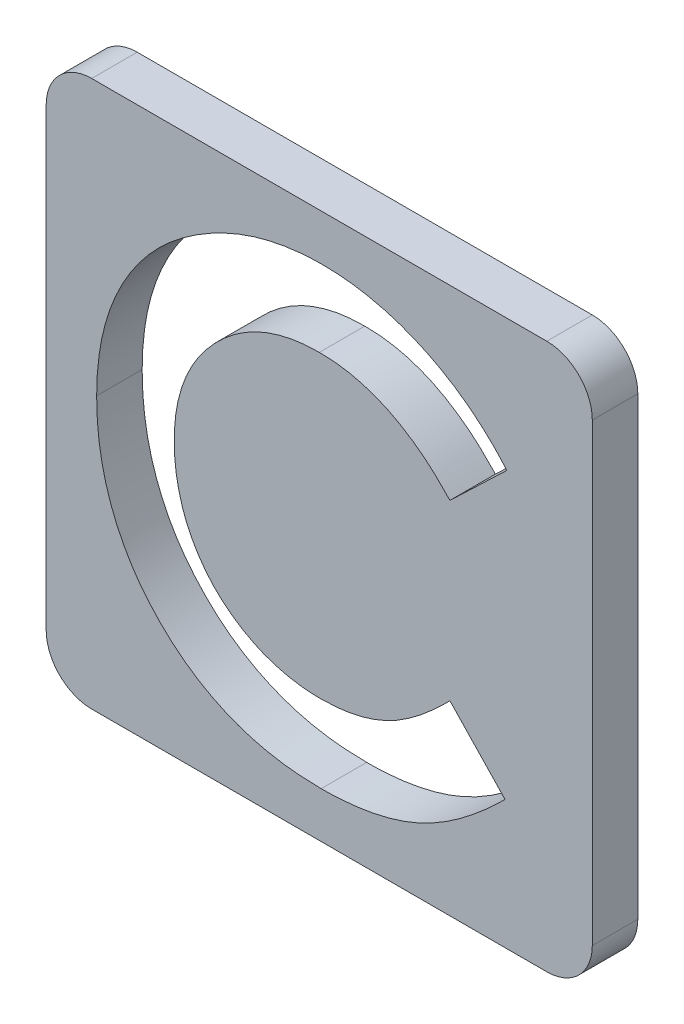
ISO-10303-21;
HEADER;
FILE_DESCRIPTION(('STEP AP214'),'2;1');
FILE_NAME('part.step','',(''),(''),'','','');
FILE_SCHEMA(('AUTOMOTIVE_DESIGN { 1 0 10303 214 1 1 1 1 }'));
ENDSEC;
DATA;
#1=APPLICATION_CONTEXT('core data for automotive mechanical design processes');
#2=APPLICATION_PROTOCOL_DEFINITION('international standard','automotive_design',2000,#1);
#3=PRODUCT_CONTEXT('',#1,'mechanical');
#4=PRODUCT('Part','Part','',(#3));
#5=PRODUCT_RELATED_PRODUCT_CATEGORY('part','',(#4));
#6=PRODUCT_DEFINITION_FORMATION('','',#4);
#7=PRODUCT_DEFINITION_CONTEXT('part definition',#1,'design');
#8=PRODUCT_DEFINITION('design','',#6,#7);
#9=PRODUCT_DEFINITION_SHAPE('','',#8);
#10=(LENGTH_UNIT() NAMED_UNIT(*) SI_UNIT(.MILLI.,.METRE.));
#11=(NAMED_UNIT(*) PLANE_ANGLE_UNIT() SI_UNIT($,.RADIAN.));
#12=(NAMED_UNIT(*) SI_UNIT($,.STERADIAN.) SOLID_ANGLE_UNIT());
#13=UNCERTAINTY_MEASURE_WITH_UNIT(LENGTH_MEASURE(1.E-05),#10,'distance_accuracy_value','');
#14=(GEOMETRIC_REPRESENTATION_CONTEXT(3) GLOBAL_UNCERTAINTY_ASSIGNED_CONTEXT((#13)) GLOBAL_UNIT_ASSIGNED_CONTEXT((#10,
#11,#12)) REPRESENTATION_CONTEXT('',''));
#15=CARTESIAN_POINT('',(0.,0.,0.));
#16=DIRECTION('',(0.,0.,1.));
#17=DIRECTION('',(1.,0.,0.));
#18=AXIS2_PLACEMENT_3D('',#15,#16,#17);
#19=CARTESIAN_POINT('',(50.,50.,10.));
#20=DIRECTION('',(0.,0.,-1.));
#21=DIRECTION('',(-1.,0.,0.));
#22=AXIS2_PLACEMENT_3D('',#19,#20,#21);
#23=PLANE('',#22);
#24=DIRECTION('',(1.,0.,0.));
#25=VECTOR('',#24,1.);
#26=CARTESIAN_POINT('',(-49.9999999999999,60.,10.));
#27=LINE('',#26,#25);
#28=CARTESIAN_POINT('',(-49.9999999999999,60.,10.));
#29=VERTEX_POINT('',#28);
#30=CARTESIAN_POINT('',(49.9999999999999,60.,10.));
#31=VERTEX_POINT('',#30);
#32=EDGE_CURVE('E276',#29,#31,#27,.T.);
#33=ORIENTED_EDGE('',*,*,#32,.F.);
#34=CARTESIAN_POINT('',(-50.,50.,10.));
#35=DIRECTION('',(0.,0.,1.));
#36=DIRECTION('',(1.,0.,0.));
#37=AXIS2_PLACEMENT_3D('',#34,#35,#36);
#38=CIRCLE('',#37,10.);
#39=CARTESIAN_POINT('',(-60.,49.9999999999999,10.));
#40=VERTEX_POINT('',#39);
#41=EDGE_CURVE('E263',#29,#40,#38,.T.);
#42=ORIENTED_EDGE('',*,*,#41,.T.);
#43=DIRECTION('',(0.,-1.,0.));
#44=VECTOR('',#43,1.);
#45=CARTESIAN_POINT('',(-60.,49.9999999999999,10.));
#46=LINE('',#45,#44);
#47=CARTESIAN_POINT('',(-60.,-49.9999999999999,10.));
#48=VERTEX_POINT('',#47);
#49=EDGE_CURVE('E291',#40,#48,#46,.T.);
#50=ORIENTED_EDGE('',*,*,#49,.T.);
#51=CARTESIAN_POINT('',(-50.,-50.,10.));
#52=DIRECTION('',(0.,0.,1.));
#53=DIRECTION('',(1.,0.,0.));
#54=AXIS2_PLACEMENT_3D('',#51,#52,#53);
#55=CIRCLE('',#54,10.);
#56=CARTESIAN_POINT('',(-49.9999999999999,-60.,10.));
#57=VERTEX_POINT('',#56);
#58=EDGE_CURVE('E295',#48,#57,#55,.T.);
#59=ORIENTED_EDGE('',*,*,#58,.T.);
#60=DIRECTION('',(1.,0.,0.));
#61=VECTOR('',#60,1.);
#62=CARTESIAN_POINT('',(-49.9999999999999,-60.,10.));
#63=LINE('',#62,#61);
#64=CARTESIAN_POINT('',(49.9999999999999,-60.,10.));
#65=VERTEX_POINT('',#64);
#66=EDGE_CURVE('E298',#57,#65,#63,.T.);
#67=ORIENTED_EDGE('',*,*,#66,.T.);
#68=CARTESIAN_POINT('',(50.,-50.,10.));
#69=DIRECTION('',(0.,0.,1.));
#70=DIRECTION('',(1.,0.,0.));
#71=AXIS2_PLACEMENT_3D('',#68,#69,#70);
#72=CIRCLE('',#71,10.);
#73=CARTESIAN_POINT('',(60.,-50.,10.));
#74=VERTEX_POINT('',#73);
#75=EDGE_CURVE('E302',#65,#74,#72,.T.);
#76=ORIENTED_EDGE('',*,*,#75,.T.);
#77=DIRECTION('',(0.,-1.,0.));
#78=VECTOR('',#77,1.);
#79=CARTESIAN_POINT('',(60.,49.9999999999999,10.));
#80=LINE('',#79,#78);
#81=CARTESIAN_POINT('',(60.,49.9999999999999,10.));
#82=VERTEX_POINT('',#81);
#83=EDGE_CURVE('E304',#82,#74,#80,.T.);
#84=ORIENTED_EDGE('',*,*,#83,.F.);
#85=CARTESIAN_POINT('',(50.,50.,10.));
#86=DIRECTION('',(0.,0.,-1.));
#87=DIRECTION('',(-1.,0.,0.));
#88=AXIS2_PLACEMENT_3D('',#85,#86,#87);
#89=CIRCLE('',#88,10.);
#90=EDGE_CURVE('E307',#31,#82,#89,.T.);
#91=ORIENTED_EDGE('',*,*,#90,.F.);
#92=EDGE_LOOP('',(#33,#42,#50,#59,#67,#76,#84,#91));
#93=FACE_BOUND('',#92,.T.);
#94=CARTESIAN_POINT('',(0.683092948717948,49.9358974358974,10.));
#95=CARTESIAN_POINT('',(1.6414388950842,49.9215416320597,10.));
#96=CARTESIAN_POINT('',(3.54816665778287,49.892979284781,10.));
#97=CARTESIAN_POINT('',(6.3876042585156,49.6548810430474,10.));
#98=CARTESIAN_POINT('',(9.20433336669228,49.2809501628442,10.));
#99=CARTESIAN_POINT('',(11.9882692277431,48.7167680966395,10.));
#100=CARTESIAN_POINT('',(14.7593253968799,48.0470126886051,10.));
#101=CARTESIAN_POINT('',(17.481087090889,47.1700603663098,10.));
#102=CARTESIAN_POINT('',(20.1964915722609,46.1925317405233,10.));
#103=CARTESIAN_POINT('',(22.8629517543219,45.0240958678139,10.));
#104=CARTESIAN_POINT('',(25.4841896245245,43.7486425696483,10.));
#105=CARTESIAN_POINT('',(27.998798557253,42.3015944837229,10.));
#106=CARTESIAN_POINT('',(30.4489986039729,40.7720013332597,10.));
#107=CARTESIAN_POINT('',(32.7804948027195,39.0693350937347,10.));
#108=CARTESIAN_POINT('',(35.036961097733,37.2553546354965,10.));
#109=CARTESIAN_POINT('',(37.2065982294083,35.3215967212293,10.));
#110=CARTESIAN_POINT('',(39.2703663632576,33.2358199292499,10.));
#111=CARTESIAN_POINT('',(40.5654726543483,31.7620955004585,10.));
#112=CARTESIAN_POINT('',(41.2179487179487,31.0196314102564,10.));
#113=B_SPLINE_CURVE_WITH_KNOTS('',3,(#94,#95,#96,#97,#98,#99,#100,#101,#102,#103,#104,#105,#106,
#107,#108,#109,#110,#111,#112),.UNSPECIFIED.,.F.,.F.,(4,1,1,1,1,1,1,1,1,1,1,1,1,1,1,1,4),(0.,
0.0622757783707705,0.123904062007518,0.185067240768729,0.246840151520206,0.308435329849778,
0.370241250709108,0.432586588879854,0.495924581661242,0.559351070950926,0.62194265420109,
0.684392867235184,0.746985808264523,0.809441464531699,0.872507832713939,0.935769297066228,1.),.UNSPECIFIED.);
#114=CARTESIAN_POINT('',(0.683092948717948,49.9358974358974,10.));
#115=VERTEX_POINT('',#114);
#116=CARTESIAN_POINT('',(41.2179487179487,31.0196314102564,10.));
#117=VERTEX_POINT('',#116);
#118=EDGE_CURVE('E50',#115,#117,#113,.T.);
#119=ORIENTED_EDGE('',*,*,#118,.T.);
#120=DIRECTION('',(-0.722880768094852,-0.690972788985642,0.));
#121=VECTOR('',#120,1.);
#122=CARTESIAN_POINT('',(41.2179487179487,31.0196314102564,10.));
#123=LINE('',#122,#121);
#124=CARTESIAN_POINT('',(28.7149439102564,19.0685096153846,10.));
#125=VERTEX_POINT('',#124);
#126=EDGE_CURVE('E174',#117,#125,#123,.T.);
#127=ORIENTED_EDGE('',*,*,#126,.T.);
#128=CARTESIAN_POINT('',(28.7149439102564,19.0685096153846,10.));
#129=CARTESIAN_POINT('',(27.6543371828896,20.1651787490928,10.));
#130=CARTESIAN_POINT('',(25.5826399671481,22.3073171424003,10.));
#131=CARTESIAN_POINT('',(22.2443561180767,25.1433195950283,10.));
#132=CARTESIAN_POINT('',(18.7726624634221,27.5067439140349,10.));
#133=CARTESIAN_POINT('',(15.2350938734894,29.49720482819,10.));
#134=CARTESIAN_POINT('',(11.5680197443271,31.0031303696967,10.));
#135=CARTESIAN_POINT('',(7.8138414387126,32.1005236779949,10.));
#136=CARTESIAN_POINT('',(3.94858742390227,32.7695628997128,10.));
#137=CARTESIAN_POINT('',(1.33273217597597,32.8461128271249,10.));
#138=CARTESIAN_POINT('',(0.0170272435897484,32.8846153846154,10.));
#139=B_SPLINE_CURVE_WITH_KNOTS('',3,(#128,#129,#130,#131,#132,#133,#134,#135,#136,#137,#138),
.UNSPECIFIED.,.F.,.F.,(4,1,1,1,1,1,1,1,4),(0.,0.139406438181739,0.272304448374159,
0.399525336271758,0.522810878257822,0.642662716591868,0.761022620809522,0.879800796783804,1.),.UNSPECIFIED.);
#140=CARTESIAN_POINT('',(0.0170272435897484,32.8846153846154,10.));
#141=VERTEX_POINT('',#140);
#142=EDGE_CURVE('E373',#125,#141,#139,.T.);
#143=ORIENTED_EDGE('',*,*,#142,.T.);
#144=CARTESIAN_POINT('',(0.0170272435897484,32.8846153846154,10.));
#145=CARTESIAN_POINT('',(-1.08174626385413,32.8541970182765,10.));
#146=CARTESIAN_POINT('',(-3.250054721012,32.7941697237171,10.));
#147=CARTESIAN_POINT('',(-6.43369974125528,32.3541104478809,10.));
#148=CARTESIAN_POINT('',(-9.47902073717016,31.6057704982814,10.));
#149=CARTESIAN_POINT('',(-12.3964423251222,30.574419426697,10.));
#150=CARTESIAN_POINT('',(-15.1773798667987,29.2399058794271,10.));
#151=CARTESIAN_POINT('',(-17.8276639433846,27.6032627352334,10.));
#152=CARTESIAN_POINT('',(-20.340760389412,25.6792712093866,10.));
#153=CARTESIAN_POINT('',(-22.683472656629,23.4778861225414,10.));
#154=CARTESIAN_POINT('',(-24.8265035071409,21.0727074879972,10.));
#155=CARTESIAN_POINT('',(-26.7200077180269,18.5063876225818,10.));
#156=CARTESIAN_POINT('',(-28.3061212304693,15.7848058216517,10.));
#157=CARTESIAN_POINT('',(-29.607818790349,12.9355242651222,10.));
#158=CARTESIAN_POINT('',(-30.6217908706497,9.94535506762493,9.99999999999999));
#159=CARTESIAN_POINT('',(-31.3458943293177,6.81631132949547,10.));
#160=CARTESIAN_POINT('',(-31.7646964183768,3.54466660145284,10.));
#161=CARTESIAN_POINT('',(-31.8272054368862,1.32062689333813,10.));
#162=CARTESIAN_POINT('',(-31.8589743589744,0.190304487179487,10.));
#163=B_SPLINE_CURVE_WITH_KNOTS('',3,(#144,#145,#146,#147,#148,#149,#150,#151,#152,#153,#154,
#155,#156,#157,#158,#159,#160,#161,#162),.UNSPECIFIED.,.F.,.F.,(4,1,1,1,1,1,1,1,1,1,1,1,1,1,1,1,
4),(0.,0.0647145165408359,0.127706968329453,0.188882162817117,0.249158298722329,
0.309661028748886,0.370224886057185,0.432332221972585,0.495781858993871,0.559304076520427,
0.621860558361525,0.683321537332506,0.744522974782334,0.806088371210511,0.868994314670206,
0.933419056808136,1.),.UNSPECIFIED.);
#164=CARTESIAN_POINT('',(-31.8589743589744,0.190304487179487,10.));
#165=VERTEX_POINT('',#164);
#166=EDGE_CURVE('E365',#141,#165,#163,.T.);
#167=ORIENTED_EDGE('',*,*,#166,.T.);
#168=CARTESIAN_POINT('',(-31.8589743589744,0.190304487179487,10.));
#169=CARTESIAN_POINT('',(-31.8498189179352,-0.603034863446468,10.));
#170=CARTESIAN_POINT('',(-31.83177335554,-2.16672302341807,10.));
#171=CARTESIAN_POINT('',(-31.634232762686,-4.4798517984017,10.));
#172=CARTESIAN_POINT('',(-31.3161458279577,-6.72413355956989,10.));
#173=CARTESIAN_POINT('',(-30.8557952256811,-8.89616881815302,10.));
#174=CARTESIAN_POINT('',(-30.2801222721053,-10.9978398793892,10.));
#175=CARTESIAN_POINT('',(-29.6047268175794,-13.0472777525623,10.));
#176=CARTESIAN_POINT('',(-28.7574531550083,-15.0161638208577,9.99999999999999));
#177=CARTESIAN_POINT('',(-27.8169666056716,-16.9273654178592,10.));
#178=CARTESIAN_POINT('',(-26.7231915867733,-18.7287330156188,10.));
#179=CARTESIAN_POINT('',(-25.5439003417232,-20.4464865204338,10.));
#180=CARTESIAN_POINT('',(-24.2651515256686,-22.0722056756717,10.));
#181=CARTESIAN_POINT('',(-22.8786626067783,-23.5992444917704,10.));
#182=CARTESIAN_POINT('',(-21.3649204790668,-25.0037387719513,10.));
#183=CARTESIAN_POINT('',(-19.7630497756387,-26.3279233303735,10.));
#184=CARTESIAN_POINT('',(-18.0460291543225,-27.5386493422964,10.));
#185=CARTESIAN_POINT('',(-16.2495254847516,-28.6663013101654,10.));
#186=CARTESIAN_POINT('',(-14.3580192454623,-29.6459021684358,10.));
#187=CARTESIAN_POINT('',(-12.4228313862602,-30.5332312938448,10.));
#188=CARTESIAN_POINT('',(-10.4146205588612,-31.2538744704302,10.));
#189=CARTESIAN_POINT('',(-8.35783793626946,-31.8347786138921,10.));
#190=CARTESIAN_POINT('',(-6.25983373465492,-32.3287508307435,10.));
#191=CARTESIAN_POINT('',(-4.10008752441208,-32.6329047056877,9.99999999999999));
#192=CARTESIAN_POINT('',(-1.89732160047327,-32.8632368752366,10.));
#193=CARTESIAN_POINT('',(-0.408621568924704,-32.8774585403721,10.));
#194=CARTESIAN_POINT('',(0.340544871794871,-32.8846153846154,10.));
#195=B_SPLINE_CURVE_WITH_KNOTS('',3,(#168,#169,#170,#171,#172,#173,#174,#175,#176,#177,#178,
#179,#180,#181,#182,#183,#184,#185,#186,#187,#188,#189,#190,#191,#192,#193,#194),.UNSPECIFIED.,
.F.,.F.,(4,1,1,1,1,1,1,1,1,1,1,1,1,1,1,1,1,1,1,1,1,1,1,1,4),(0.,0.0459858533955716,
0.0906390618643955,0.134485273386869,0.177331356125942,0.219264832978247,0.260785002358145,
0.302316572337849,0.343435729403752,0.384181473765631,0.424375738997743,0.464181121951782,
0.50401198252761,0.543822462310405,0.583802464576023,0.624418535098884,0.665547559578536,
0.706674939653633,0.747826978897574,0.788895116557047,0.830219357972813,0.871706936947863,
0.913733853604737,0.956587827984187,1.),.UNSPECIFIED.);
#196=CARTESIAN_POINT('',(0.340544871794871,-32.8846153846154,10.));
#197=VERTEX_POINT('',#196);
#198=EDGE_CURVE('E357',#165,#197,#195,.T.);
#199=ORIENTED_EDGE('',*,*,#198,.T.);
#200=CARTESIAN_POINT('',(0.340544871794871,-32.8846153846154,10.));
#201=CARTESIAN_POINT('',(1.61125990285429,-32.8478595625839,10.));
#202=CARTESIAN_POINT('',(4.10788450320254,-32.7756439302455,10.));
#203=CARTESIAN_POINT('',(7.77204008696177,-32.2109279112574,10.));
#204=CARTESIAN_POINT('',(11.2636153187849,-31.2820020170017,10.));
#205=CARTESIAN_POINT('',(14.0533672208292,-30.1849945120394,10.));
#206=CARTESIAN_POINT('',(16.2390641482272,-29.1016853592582,10.));
#207=CARTESIAN_POINT('',(17.903002907688,-28.0996777401587,10.));
#208=CARTESIAN_POINT('',(19.6236452718875,-26.9788222038627,10.));
#209=CARTESIAN_POINT('',(21.3724128426247,-25.69681644862,10.));
#210=CARTESIAN_POINT('',(23.1689757860175,-24.269045057575,10.));
#211=CARTESIAN_POINT('',(24.9816206235545,-22.6642371732615,10.));
#212=CARTESIAN_POINT('',(26.8567513849792,-20.9352368171773,10.));
#213=CARTESIAN_POINT('',(28.0851309596324,-19.7012152962966,10.));
#214=CARTESIAN_POINT('',(28.7149439102564,-19.0685096153846,10.));
#215=B_SPLINE_CURVE_WITH_KNOTS('',3,(#200,#201,#202,#203,#204,#205,#206,#207,#208,#209,#210,
#211,#212,#213,#214),.UNSPECIFIED.,.F.,.F.,(4,1,1,1,1,1,1,1,1,1,1,1,4),(0.,0.117048429048343,
0.229969725903514,0.340703507658765,0.449355146911558,0.50555651152082,0.565302669775755,
0.628204956476601,0.694728991831128,0.765018833651914,0.839580202195728,0.917749799590948,1.),.UNSPECIFIED.);
#216=CARTESIAN_POINT('',(28.7149439102564,-19.0685096153846,10.));
#217=VERTEX_POINT('',#216);
#218=EDGE_CURVE('E352',#197,#217,#215,.T.);
#219=ORIENTED_EDGE('',*,*,#218,.T.);
#220=DIRECTION('',(0.689574074589039,-0.724215158398849,0.));
#221=VECTOR('',#220,1.);
#222=CARTESIAN_POINT('',(28.7149439102564,-19.0685096153846,10.));
#223=LINE('',#222,#221);
#224=CARTESIAN_POINT('',(40.8373397435898,-31.7998798076923,10.));
#225=VERTEX_POINT('',#224);
#226=EDGE_CURVE('E346',#217,#225,#223,.T.);
#227=ORIENTED_EDGE('',*,*,#226,.T.);
#228=CARTESIAN_POINT('',(40.8373397435898,-31.7998798076923,10.));
#229=CARTESIAN_POINT('',(39.9852005661752,-32.6225934310408,10.));
#230=CARTESIAN_POINT('',(38.322007127671,-34.2283544808645,10.));
#231=CARTESIAN_POINT('',(35.8131259977684,-36.5083853312382,10.));
#232=CARTESIAN_POINT('',(33.3074023940033,-38.5572465113824,10.));
#233=CARTESIAN_POINT('',(30.8653693786104,-40.4493027025307,10.));
#234=CARTESIAN_POINT('',(28.4470239038456,-42.1294337124443,10.));
#235=CARTESIAN_POINT('',(26.052622431243,-43.5993175079247,10.));
#236=CARTESIAN_POINT('',(23.7092706321045,-44.8961295763549,10.));
#237=CARTESIAN_POINT('',(21.3683080555382,-45.9979998183041,10.));
#238=CARTESIAN_POINT('',(19.0151680241677,-46.9336020935463,10.));
#239=CARTESIAN_POINT('',(16.5940634634566,-47.7390942430533,10.));
#240=CARTESIAN_POINT('',(14.0975928289585,-48.4205116240085,10.));
#241=CARTESIAN_POINT('',(11.5105088172133,-48.9703259582788,10.));
#242=CARTESIAN_POINT('',(8.85694217143702,-49.4112028294906,10.));
#243=CARTESIAN_POINT('',(6.11205903351559,-49.7087921675179,10.));
#244=CARTESIAN_POINT('',(3.29326331804326,-49.9088515785832,10.));
#245=CARTESIAN_POINT('',(1.38123051406405,-49.9268285745489,10.));
#246=CARTESIAN_POINT('',(0.416666666666669,-49.9358974358974,10.));
#247=B_SPLINE_CURVE_WITH_KNOTS('',3,(#228,#229,#230,#231,#232,#233,#234,#235,#236,#237,#238,
#239,#240,#241,#242,#243,#244,#245,#246),.UNSPECIFIED.,.F.,.F.,(4,1,1,1,1,1,1,1,1,1,1,1,1,1,1,1,
4),(0.,0.0777829363133484,0.15181565726911,0.222539838580063,0.290277534682293,0.35464060748638,
0.415797753485032,0.474709007669867,0.530426099620042,0.585579745825265,0.640906164804031,
0.697901090665671,0.755420320880605,0.814521258487291,0.874461831215908,0.936669716740424,1.),.UNSPECIFIED.);
#248=CARTESIAN_POINT('',(0.416666666666669,-49.9358974358974,10.));
#249=VERTEX_POINT('',#248);
#250=EDGE_CURVE('E338',#225,#249,#247,.T.);
#251=ORIENTED_EDGE('',*,*,#250,.T.);
#252=CARTESIAN_POINT('',(0.416666666666669,-49.9358974358974,10.));
#253=CARTESIAN_POINT('',(-1.35511764048741,-49.8907311204767,10.));
#254=CARTESIAN_POINT('',(-4.8220070317626,-49.8023531959502,10.));
#255=CARTESIAN_POINT('',(-9.9026430411407,-49.1475326122616,10.));
#256=CARTESIAN_POINT('',(-14.7291108685673,-48.0497374394682,10.));
#257=CARTESIAN_POINT('',(-19.3131524067437,-46.4971522687101,10.));
#258=CARTESIAN_POINT('',(-23.65331003716,-44.5137974765133,10.));
#259=CARTESIAN_POINT('',(-27.748473415126,-42.0822976319479,10.));
#260=CARTESIAN_POINT('',(-31.5920420476894,-39.2091128467249,10.));
#261=CARTESIAN_POINT('',(-35.1529674656885,-35.9279196360063,10.));
#262=CARTESIAN_POINT('',(-38.3739939777715,-32.3041171888927,10.));
#263=CARTESIAN_POINT('',(-41.2210084009614,-28.4131475158562,10.));
#264=CARTESIAN_POINT('',(-43.576058839203,-24.2358879265889,10.));
#265=CARTESIAN_POINT('',(-45.5315079636882,-19.834049889149,10.));
#266=CARTESIAN_POINT('',(-47.0606434613855,-15.1875461067638,10.));
#267=CARTESIAN_POINT('',(-48.1368956209843,-10.2913504774402,10.));
#268=CARTESIAN_POINT('',(-48.8006124732255,-5.15019058080106,10.));
#269=CARTESIAN_POINT('',(-48.8732240401022,-1.63865985863004,10.));
#270=CARTESIAN_POINT('',(-48.9102564102564,0.152243589743591,10.));
#271=B_SPLINE_CURVE_WITH_KNOTS('',3,(#252,#253,#254,#255,#256,#257,#258,#259,#260,#261,#262,
#263,#264,#265,#266,#267,#268,#269,#270),.UNSPECIFIED.,.F.,.F.,(4,1,1,1,1,1,1,1,1,1,1,1,1,1,1,1,
4),(0.,0.0673762427992636,0.13183657877631,0.194461067601586,0.255345967743414,
0.315588340013611,0.375627451772199,0.436137852052541,0.497778619574713,0.559470361094052,
0.620277769679113,0.680787688960419,0.741491621591654,0.803215436253189,0.866492762748931,
0.93191044291136,1.),.UNSPECIFIED.);
#272=CARTESIAN_POINT('',(-48.9102564102564,0.152243589743591,10.));
#273=VERTEX_POINT('',#272);
#274=EDGE_CURVE('E330',#249,#273,#271,.T.);
#275=ORIENTED_EDGE('',*,*,#274,.T.);
#276=CARTESIAN_POINT('',(-48.9102564102564,0.152243589743591,10.));
#277=CARTESIAN_POINT('',(-48.8946083254413,1.32025553906331,10.));
#278=CARTESIAN_POINT('',(-48.8635976458552,3.63496975112692,10.));
#279=CARTESIAN_POINT('',(-48.5376725314663,7.04473131735693,10.));
#280=CARTESIAN_POINT('',(-48.0833139704202,10.3686389312451,10.));
#281=CARTESIAN_POINT('',(-47.3625154285296,13.5721794174049,10.));
#282=CARTESIAN_POINT('',(-46.4936638775408,16.6985103745436,10.));
#283=CARTESIAN_POINT('',(-45.4131328198244,19.7136522362996,10.));
#284=CARTESIAN_POINT('',(-44.1226480127642,22.6262708239943,10.));
#285=CARTESIAN_POINT('',(-42.6638048206116,25.4412420361837,10.));
#286=CARTESIAN_POINT('',(-41.0134301128869,28.1401247952757,10.));
#287=CARTESIAN_POINT('',(-39.1697803870455,30.6997314449122,10.));
#288=CARTESIAN_POINT('',(-37.1803183762632,33.1398216771891,10.));
#289=CARTESIAN_POINT('',(-34.9972405495233,35.4280231654656,10.));
#290=CARTESIAN_POINT('',(-32.6522698879186,37.5844267636515,10.));
#291=CARTESIAN_POINT('',(-30.1348191176785,39.5973465075458,10.));
#292=CARTESIAN_POINT('',(-27.4600294476838,41.4956499372077,10.));
#293=CARTESIAN_POINT('',(-24.6206612168742,43.2303844145202,10.));
#294=CARTESIAN_POINT('',(-21.6718757842472,44.799543953991,10.));
#295=CARTESIAN_POINT('',(-18.6508650941563,46.1836096851907,10.));
#296=CARTESIAN_POINT('',(-15.565051419364,47.3403699093811,10.));
#297=CARTESIAN_POINT('',(-12.4274818596488,48.2998598447642,10.));
#298=CARTESIAN_POINT('',(-9.2249002238419,49.0160512377176,10.));
#299=CARTESIAN_POINT('',(-5.98016572462047,49.558185017584,10.));
#300=CARTESIAN_POINT('',(-2.66566956771341,49.8612412667287,10.));
#301=CARTESIAN_POINT('',(-0.440272541660435,49.9108535088717,10.));
#302=CARTESIAN_POINT('',(0.683092948717948,49.9358974358974,10.));
#303=B_SPLINE_CURVE_WITH_KNOTS('',3,(#276,#277,#278,#279,#280,#281,#282,#283,#284,#285,#286,
#287,#288,#289,#290,#291,#292,#293,#294,#295,#296,#297,#298,#299,#300,#301,#302),.UNSPECIFIED.,
.F.,.F.,(4,1,1,1,1,1,1,1,1,1,1,1,1,1,1,1,1,1,1,1,1,1,1,1,4),(0.,0.0446633309063708,
0.0885118057801454,0.130925591301777,0.172904037280887,0.214000119904966,0.254985020358983,
0.295291276387059,0.335772441952788,0.37618082055377,0.416178408474521,0.456350051444474,
0.496512166644416,0.53704057363778,0.578118744007762,0.619724560554812,0.662421970198883,
0.705298953520903,0.747430000533911,0.789432984039383,0.831267421203061,0.872825095964229,
0.914870110484392,0.9570270028395,1.),.UNSPECIFIED.);
#304=EDGE_CURVE('E168',#273,#115,#303,.T.);
#305=ORIENTED_EDGE('',*,*,#304,.T.);
#306=EDGE_LOOP('',(#119,#127,#143,#167,#199,#219,#227,#251,#275,#305));
#307=FACE_BOUND('',#306,.T.);
#308=ADVANCED_FACE('F33',(#93,#307),#23,.F.);
#309=CARTESIAN_POINT('',(50.,50.,0.));
#310=DIRECTION('',(0.,0.,-1.));
#311=DIRECTION('',(-1.,0.,0.));
#312=AXIS2_PLACEMENT_3D('',#309,#310,#311);
#313=PLANE('',#312);
#314=DIRECTION('',(1.,0.,0.));
#315=VECTOR('',#314,1.);
#316=CARTESIAN_POINT('',(-49.9999999999999,60.,0.));
#317=LINE('',#316,#315);
#318=CARTESIAN_POINT('',(-49.9999999999999,60.,0.));
#319=VERTEX_POINT('',#318);
#320=CARTESIAN_POINT('',(49.9999999999999,60.,0.));
#321=VERTEX_POINT('',#320);
#322=EDGE_CURVE('E175',#319,#321,#317,.T.);
#323=ORIENTED_EDGE('',*,*,#322,.T.);
#324=CARTESIAN_POINT('',(50.,50.,0.));
#325=DIRECTION('',(0.,0.,-1.));
#326=DIRECTION('',(-1.,0.,0.));
#327=AXIS2_PLACEMENT_3D('',#324,#325,#326);
#328=CIRCLE('',#327,10.);
#329=CARTESIAN_POINT('',(60.,49.9999999999999,0.));
#330=VERTEX_POINT('',#329);
#331=EDGE_CURVE('E247',#321,#330,#328,.T.);
#332=ORIENTED_EDGE('',*,*,#331,.T.);
#333=DIRECTION('',(0.,-1.,0.));
#334=VECTOR('',#333,1.);
#335=CARTESIAN_POINT('',(60.,49.9999999999999,0.));
#336=LINE('',#335,#334);
#337=CARTESIAN_POINT('',(60.,-50.,0.));
#338=VERTEX_POINT('',#337);
#339=EDGE_CURVE('E254',#330,#338,#336,.T.);
#340=ORIENTED_EDGE('',*,*,#339,.T.);
#341=CARTESIAN_POINT('',(50.,-50.,0.));
#342=DIRECTION('',(0.,0.,1.));
#343=DIRECTION('',(1.,0.,0.));
#344=AXIS2_PLACEMENT_3D('',#341,#342,#343);
#345=CIRCLE('',#344,10.);
#346=CARTESIAN_POINT('',(49.9999999999999,-60.,0.));
#347=VERTEX_POINT('',#346);
#348=EDGE_CURVE('E267',#347,#338,#345,.T.);
#349=ORIENTED_EDGE('',*,*,#348,.F.);
#350=DIRECTION('',(1.,0.,0.));
#351=VECTOR('',#350,1.);
#352=CARTESIAN_POINT('',(-49.9999999999999,-60.,0.));
#353=LINE('',#352,#351);
#354=CARTESIAN_POINT('',(-49.9999999999999,-60.,0.));
#355=VERTEX_POINT('',#354);
#356=EDGE_CURVE('E270',#355,#347,#353,.T.);
#357=ORIENTED_EDGE('',*,*,#356,.F.);
#358=CARTESIAN_POINT('',(-50.,-50.,0.));
#359=DIRECTION('',(0.,0.,1.));
#360=DIRECTION('',(1.,0.,0.));
#361=AXIS2_PLACEMENT_3D('',#358,#359,#360);
#362=CIRCLE('',#361,10.);
#363=CARTESIAN_POINT('',(-60.,-49.9999999999999,0.));
#364=VERTEX_POINT('',#363);
#365=EDGE_CURVE('E272',#364,#355,#362,.T.);
#366=ORIENTED_EDGE('',*,*,#365,.F.);
#367=DIRECTION('',(0.,-1.,0.));
#368=VECTOR('',#367,1.);
#369=CARTESIAN_POINT('',(-60.,49.9999999999999,0.));
#370=LINE('',#369,#368);
#371=CARTESIAN_POINT('',(-60.,49.9999999999999,0.));
#372=VERTEX_POINT('',#371);
#373=EDGE_CURVE('E274',#372,#364,#370,.T.);
#374=ORIENTED_EDGE('',*,*,#373,.F.);
#375=CARTESIAN_POINT('',(-50.,50.,0.));
#376=DIRECTION('',(0.,0.,1.));
#377=DIRECTION('',(1.,0.,0.));
#378=AXIS2_PLACEMENT_3D('',#375,#376,#377);
#379=CIRCLE('',#378,10.);
#380=EDGE_CURVE('E259',#319,#372,#379,.T.);
#381=ORIENTED_EDGE('',*,*,#380,.F.);
#382=EDGE_LOOP('',(#323,#332,#340,#349,#357,#366,#374,#381));
#383=FACE_BOUND('',#382,.T.);
#384=DIRECTION('',(-0.722880768094852,-0.690972788985642,0.));
#385=VECTOR('',#384,1.);
#386=CARTESIAN_POINT('',(41.2179487179487,31.0196314102564,0.));
#387=LINE('',#386,#385);
#388=CARTESIAN_POINT('',(41.2179487179487,31.0196314102564,0.));
#389=VERTEX_POINT('',#388);
#390=CARTESIAN_POINT('',(28.7149439102564,19.0685096153846,0.));
#391=VERTEX_POINT('',#390);
#392=EDGE_CURVE('E167',#389,#391,#387,.T.);
#393=ORIENTED_EDGE('',*,*,#392,.F.);
#394=CARTESIAN_POINT('',(0.683092948717948,49.9358974358974,0.));
#395=CARTESIAN_POINT('',(1.6414388950842,49.9215416320597,0.));
#396=CARTESIAN_POINT('',(3.54816665778287,49.892979284781,0.));
#397=CARTESIAN_POINT('',(6.3876042585156,49.6548810430474,0.));
#398=CARTESIAN_POINT('',(9.20433336669228,49.2809501628442,0.));
#399=CARTESIAN_POINT('',(11.9882692277431,48.7167680966395,0.));
#400=CARTESIAN_POINT('',(14.7593253968799,48.0470126886051,0.));
#401=CARTESIAN_POINT('',(17.481087090889,47.1700603663098,0.));
#402=CARTESIAN_POINT('',(20.1964915722609,46.1925317405233,0.));
#403=CARTESIAN_POINT('',(22.8629517543219,45.0240958678139,0.));
#404=CARTESIAN_POINT('',(25.4841896245245,43.7486425696483,0.));
#405=CARTESIAN_POINT('',(27.998798557253,42.3015944837229,0.));
#406=CARTESIAN_POINT('',(30.4489986039729,40.7720013332597,0.));
#407=CARTESIAN_POINT('',(32.7804948027195,39.0693350937347,0.));
#408=CARTESIAN_POINT('',(35.036961097733,37.2553546354965,0.));
#409=CARTESIAN_POINT('',(37.2065982294083,35.3215967212293,0.));
#410=CARTESIAN_POINT('',(39.2703663632576,33.2358199292499,0.));
#411=CARTESIAN_POINT('',(40.5654726543483,31.7620955004585,0.));
#412=CARTESIAN_POINT('',(41.2179487179487,31.0196314102564,0.));
#413=B_SPLINE_CURVE_WITH_KNOTS('',3,(#394,#395,#396,#397,#398,#399,#400,#401,#402,#403,#404,
#405,#406,#407,#408,#409,#410,#411,#412),.UNSPECIFIED.,.F.,.F.,(4,1,1,1,1,1,1,1,1,1,1,1,1,1,1,1,
4),(0.,0.0622757783707705,0.123904062007518,0.185067240768729,0.246840151520206,
0.308435329849778,0.370241250709108,0.432586588879854,0.495924581661242,0.559351070950926,
0.62194265420109,0.684392867235184,0.746985808264523,0.809441464531699,0.872507832713939,
0.935769297066228,1.),.UNSPECIFIED.);
#414=CARTESIAN_POINT('',(0.683092948717948,49.9358974358974,0.));
#415=VERTEX_POINT('',#414);
#416=EDGE_CURVE('E159',#415,#389,#413,.T.);
#417=ORIENTED_EDGE('',*,*,#416,.F.);
#418=CARTESIAN_POINT('',(-48.9102564102564,0.152243589743591,0.));
#419=CARTESIAN_POINT('',(-48.8946083254413,1.32025553906331,0.));
#420=CARTESIAN_POINT('',(-48.8635976458552,3.63496975112692,0.));
#421=CARTESIAN_POINT('',(-48.5376725314663,7.04473131735693,0.));
#422=CARTESIAN_POINT('',(-48.0833139704202,10.3686389312451,0.));
#423=CARTESIAN_POINT('',(-47.3625154285296,13.5721794174049,0.));
#424=CARTESIAN_POINT('',(-46.4936638775408,16.6985103745436,0.));
#425=CARTESIAN_POINT('',(-45.4131328198244,19.7136522362996,0.));
#426=CARTESIAN_POINT('',(-44.1226480127642,22.6262708239943,0.));
#427=CARTESIAN_POINT('',(-42.6638048206116,25.4412420361837,0.));
#428=CARTESIAN_POINT('',(-41.0134301128869,28.1401247952757,0.));
#429=CARTESIAN_POINT('',(-39.1697803870455,30.6997314449122,0.));
#430=CARTESIAN_POINT('',(-37.1803183762632,33.1398216771891,0.));
#431=CARTESIAN_POINT('',(-34.9972405495233,35.4280231654656,0.));
#432=CARTESIAN_POINT('',(-32.6522698879186,37.5844267636515,0.));
#433=CARTESIAN_POINT('',(-30.1348191176785,39.5973465075458,0.));
#434=CARTESIAN_POINT('',(-27.4600294476838,41.4956499372077,0.));
#435=CARTESIAN_POINT('',(-24.6206612168742,43.2303844145202,0.));
#436=CARTESIAN_POINT('',(-21.6718757842472,44.799543953991,0.));
#437=CARTESIAN_POINT('',(-18.6508650941563,46.1836096851907,0.));
#438=CARTESIAN_POINT('',(-15.565051419364,47.3403699093811,0.));
#439=CARTESIAN_POINT('',(-12.4274818596488,48.2998598447642,0.));
#440=CARTESIAN_POINT('',(-9.2249002238419,49.0160512377176,0.));
#441=CARTESIAN_POINT('',(-5.98016572462047,49.558185017584,0.));
#442=CARTESIAN_POINT('',(-2.66566956771341,49.8612412667287,0.));
#443=CARTESIAN_POINT('',(-0.440272541660435,49.9108535088717,0.));
#444=CARTESIAN_POINT('',(0.683092948717948,49.9358974358974,0.));
#445=B_SPLINE_CURVE_WITH_KNOTS('',3,(#418,#419,#420,#421,#422,#423,#424,#425,#426,#427,#428,
#429,#430,#431,#432,#433,#434,#435,#436,#437,#438,#439,#440,#441,#442,#443,#444),.UNSPECIFIED.,
.F.,.F.,(4,1,1,1,1,1,1,1,1,1,1,1,1,1,1,1,1,1,1,1,1,1,1,1,4),(0.,0.0446633309063708,
0.0885118057801454,0.130925591301777,0.172904037280887,0.214000119904966,0.254985020358983,
0.295291276387059,0.335772441952788,0.37618082055377,0.416178408474521,0.456350051444474,
0.496512166644416,0.53704057363778,0.578118744007762,0.619724560554812,0.662421970198883,
0.705298953520903,0.747430000533911,0.789432984039383,0.831267421203061,0.872825095964229,
0.914870110484392,0.9570270028395,1.),.UNSPECIFIED.);
#446=CARTESIAN_POINT('',(-48.9102564102564,0.152243589743591,0.));
#447=VERTEX_POINT('',#446);
#448=EDGE_CURVE('E325',#447,#415,#445,.T.);
#449=ORIENTED_EDGE('',*,*,#448,.F.);
#450=CARTESIAN_POINT('',(0.416666666666669,-49.9358974358974,0.));
#451=CARTESIAN_POINT('',(-1.35511764048741,-49.8907311204767,0.));
#452=CARTESIAN_POINT('',(-4.8220070317626,-49.8023531959502,0.));
#453=CARTESIAN_POINT('',(-9.9026430411407,-49.1475326122616,0.));
#454=CARTESIAN_POINT('',(-14.7291108685673,-48.0497374394682,0.));
#455=CARTESIAN_POINT('',(-19.3131524067437,-46.4971522687101,0.));
#456=CARTESIAN_POINT('',(-23.65331003716,-44.5137974765133,0.));
#457=CARTESIAN_POINT('',(-27.748473415126,-42.0822976319479,0.));
#458=CARTESIAN_POINT('',(-31.5920420476894,-39.2091128467249,0.));
#459=CARTESIAN_POINT('',(-35.1529674656885,-35.9279196360063,0.));
#460=CARTESIAN_POINT('',(-38.3739939777715,-32.3041171888927,0.));
#461=CARTESIAN_POINT('',(-41.2210084009614,-28.4131475158562,0.));
#462=CARTESIAN_POINT('',(-43.576058839203,-24.2358879265889,0.));
#463=CARTESIAN_POINT('',(-45.5315079636882,-19.834049889149,0.));
#464=CARTESIAN_POINT('',(-47.0606434613855,-15.1875461067638,0.));
#465=CARTESIAN_POINT('',(-48.1368956209843,-10.2913504774402,0.));
#466=CARTESIAN_POINT('',(-48.8006124732255,-5.15019058080106,0.));
#467=CARTESIAN_POINT('',(-48.8732240401022,-1.63865985863004,0.));
#468=CARTESIAN_POINT('',(-48.9102564102564,0.152243589743591,0.));
#469=B_SPLINE_CURVE_WITH_KNOTS('',3,(#450,#451,#452,#453,#454,#455,#456,#457,#458,#459,#460,
#461,#462,#463,#464,#465,#466,#467,#468),.UNSPECIFIED.,.F.,.F.,(4,1,1,1,1,1,1,1,1,1,1,1,1,1,1,1,
4),(0.,0.0673762427992636,0.13183657877631,0.194461067601586,0.255345967743414,
0.315588340013611,0.375627451772199,0.436137852052541,0.497778619574713,0.559470361094052,
0.620277769679113,0.680787688960419,0.741491621591654,0.803215436253189,0.866492762748931,
0.93191044291136,1.),.UNSPECIFIED.);
#470=CARTESIAN_POINT('',(0.416666666666669,-49.9358974358974,0.));
#471=VERTEX_POINT('',#470);
#472=EDGE_CURVE('E395',#471,#447,#469,.T.);
#473=ORIENTED_EDGE('',*,*,#472,.F.);
#474=CARTESIAN_POINT('',(40.8373397435898,-31.7998798076923,0.));
#475=CARTESIAN_POINT('',(39.9852005661752,-32.6225934310408,0.));
#476=CARTESIAN_POINT('',(38.322007127671,-34.2283544808645,0.));
#477=CARTESIAN_POINT('',(35.8131259977684,-36.5083853312382,0.));
#478=CARTESIAN_POINT('',(33.3074023940033,-38.5572465113824,0.));
#479=CARTESIAN_POINT('',(30.8653693786104,-40.4493027025307,0.));
#480=CARTESIAN_POINT('',(28.4470239038456,-42.1294337124443,0.));
#481=CARTESIAN_POINT('',(26.052622431243,-43.5993175079247,0.));
#482=CARTESIAN_POINT('',(23.7092706321045,-44.8961295763549,0.));
#483=CARTESIAN_POINT('',(21.3683080555382,-45.9979998183041,0.));
#484=CARTESIAN_POINT('',(19.0151680241677,-46.9336020935463,0.));
#485=CARTESIAN_POINT('',(16.5940634634566,-47.7390942430533,0.));
#486=CARTESIAN_POINT('',(14.0975928289585,-48.4205116240085,0.));
#487=CARTESIAN_POINT('',(11.5105088172133,-48.9703259582788,0.));
#488=CARTESIAN_POINT('',(8.85694217143702,-49.4112028294906,0.));
#489=CARTESIAN_POINT('',(6.11205903351559,-49.7087921675179,0.));
#490=CARTESIAN_POINT('',(3.29326331804326,-49.9088515785832,0.));
#491=CARTESIAN_POINT('',(1.38123051406405,-49.9268285745489,0.));
#492=CARTESIAN_POINT('',(0.416666666666669,-49.9358974358974,0.));
#493=B_SPLINE_CURVE_WITH_KNOTS('',3,(#474,#475,#476,#477,#478,#479,#480,#481,#482,#483,#484,
#485,#486,#487,#488,#489,#490,#491,#492),.UNSPECIFIED.,.F.,.F.,(4,1,1,1,1,1,1,1,1,1,1,1,1,1,1,1,
4),(0.,0.0777829363133484,0.15181565726911,0.222539838580063,0.290277534682293,0.35464060748638,
0.415797753485032,0.474709007669867,0.530426099620042,0.585579745825265,0.640906164804031,
0.697901090665671,0.755420320880605,0.814521258487291,0.874461831215908,0.936669716740424,1.),.UNSPECIFIED.);
#494=CARTESIAN_POINT('',(40.8373397435898,-31.7998798076923,0.));
#495=VERTEX_POINT('',#494);
#496=EDGE_CURVE('E417',#495,#471,#493,.T.);
#497=ORIENTED_EDGE('',*,*,#496,.F.);
#498=DIRECTION('',(0.689574074589039,-0.724215158398849,0.));
#499=VECTOR('',#498,1.);
#500=CARTESIAN_POINT('',(28.7149439102564,-19.0685096153846,0.));
#501=LINE('',#500,#499);
#502=CARTESIAN_POINT('',(28.7149439102564,-19.0685096153846,0.));
#503=VERTEX_POINT('',#502);
#504=EDGE_CURVE('E422',#503,#495,#501,.T.);
#505=ORIENTED_EDGE('',*,*,#504,.F.);
#506=CARTESIAN_POINT('',(0.340544871794871,-32.8846153846154,0.));
#507=CARTESIAN_POINT('',(1.61125990285429,-32.8478595625839,0.));
#508=CARTESIAN_POINT('',(4.10788450320254,-32.7756439302455,0.));
#509=CARTESIAN_POINT('',(7.77204008696177,-32.2109279112574,0.));
#510=CARTESIAN_POINT('',(11.2636153187849,-31.2820020170017,0.));
#511=CARTESIAN_POINT('',(14.0533672208292,-30.1849945120394,0.));
#512=CARTESIAN_POINT('',(16.2390641482272,-29.1016853592582,0.));
#513=CARTESIAN_POINT('',(17.903002907688,-28.0996777401587,0.));
#514=CARTESIAN_POINT('',(19.6236452718875,-26.9788222038627,0.));
#515=CARTESIAN_POINT('',(21.3724128426247,-25.69681644862,0.));
#516=CARTESIAN_POINT('',(23.1689757860175,-24.269045057575,0.));
#517=CARTESIAN_POINT('',(24.9816206235545,-22.6642371732615,0.));
#518=CARTESIAN_POINT('',(26.8567513849792,-20.9352368171773,0.));
#519=CARTESIAN_POINT('',(28.0851309596324,-19.7012152962966,0.));
#520=CARTESIAN_POINT('',(28.7149439102564,-19.0685096153846,0.));
#521=B_SPLINE_CURVE_WITH_KNOTS('',3,(#506,#507,#508,#509,#510,#511,#512,#513,#514,#515,#516,
#517,#518,#519,#520),.UNSPECIFIED.,.F.,.F.,(4,1,1,1,1,1,1,1,1,1,1,1,4),(0.,0.117048429048343,
0.229969725903514,0.340703507658765,0.449355146911558,0.50555651152082,0.565302669775755,
0.628204956476601,0.694728991831128,0.765018833651914,0.839580202195728,0.917749799590948,1.),.UNSPECIFIED.);
#522=CARTESIAN_POINT('',(0.340544871794871,-32.8846153846154,0.));
#523=VERTEX_POINT('',#522);
#524=EDGE_CURVE('E427',#523,#503,#521,.T.);
#525=ORIENTED_EDGE('',*,*,#524,.F.);
#526=CARTESIAN_POINT('',(-31.8589743589744,0.190304487179487,0.));
#527=CARTESIAN_POINT('',(-31.8498189179352,-0.603034863446468,0.));
#528=CARTESIAN_POINT('',(-31.83177335554,-2.16672302341807,0.));
#529=CARTESIAN_POINT('',(-31.634232762686,-4.4798517984017,0.));
#530=CARTESIAN_POINT('',(-31.3161458279577,-6.72413355956989,0.));
#531=CARTESIAN_POINT('',(-30.8557952256811,-8.89616881815302,0.));
#532=CARTESIAN_POINT('',(-30.2801222721053,-10.9978398793892,0.));
#533=CARTESIAN_POINT('',(-29.6047268175794,-13.0472777525623,0.));
#534=CARTESIAN_POINT('',(-28.7574531550083,-15.0161638208577,0.));
#535=CARTESIAN_POINT('',(-27.8169666056716,-16.9273654178592,0.));
#536=CARTESIAN_POINT('',(-26.7231915867733,-18.7287330156188,0.));
#537=CARTESIAN_POINT('',(-25.5439003417232,-20.4464865204338,0.));
#538=CARTESIAN_POINT('',(-24.2651515256686,-22.0722056756717,0.));
#539=CARTESIAN_POINT('',(-22.8786626067783,-23.5992444917704,0.));
#540=CARTESIAN_POINT('',(-21.3649204790668,-25.0037387719513,0.));
#541=CARTESIAN_POINT('',(-19.7630497756387,-26.3279233303735,0.));
#542=CARTESIAN_POINT('',(-18.0460291543225,-27.5386493422964,0.));
#543=CARTESIAN_POINT('',(-16.2495254847516,-28.6663013101654,0.));
#544=CARTESIAN_POINT('',(-14.3580192454623,-29.6459021684358,0.));
#545=CARTESIAN_POINT('',(-12.4228313862602,-30.5332312938448,0.));
#546=CARTESIAN_POINT('',(-10.4146205588612,-31.2538744704302,0.));
#547=CARTESIAN_POINT('',(-8.35783793626946,-31.8347786138921,0.));
#548=CARTESIAN_POINT('',(-6.25983373465492,-32.3287508307435,0.));
#549=CARTESIAN_POINT('',(-4.10008752441208,-32.6329047056877,0.));
#550=CARTESIAN_POINT('',(-1.89732160047327,-32.8632368752366,0.));
#551=CARTESIAN_POINT('',(-0.408621568924704,-32.8774585403721,0.));
#552=CARTESIAN_POINT('',(0.340544871794871,-32.8846153846154,0.));
#553=B_SPLINE_CURVE_WITH_KNOTS('',3,(#526,#527,#528,#529,#530,#531,#532,#533,#534,#535,#536,
#537,#538,#539,#540,#541,#542,#543,#544,#545,#546,#547,#548,#549,#550,#551,#552),.UNSPECIFIED.,
.F.,.F.,(4,1,1,1,1,1,1,1,1,1,1,1,1,1,1,1,1,1,1,1,1,1,1,1,4),(0.,0.0459858533955716,
0.0906390618643955,0.134485273386869,0.177331356125942,0.219264832978247,0.260785002358145,
0.302316572337849,0.343435729403752,0.384181473765631,0.424375738997743,0.464181121951782,
0.50401198252761,0.543822462310405,0.583802464576023,0.624418535098884,0.665547559578536,
0.706674939653633,0.747826978897574,0.788895116557047,0.830219357972813,0.871706936947863,
0.913733853604737,0.956587827984187,1.),.UNSPECIFIED.);
#554=CARTESIAN_POINT('',(-31.8589743589744,0.190304487179487,0.));
#555=VERTEX_POINT('',#554);
#556=EDGE_CURVE('E431',#555,#523,#553,.T.);
#557=ORIENTED_EDGE('',*,*,#556,.F.);
#558=CARTESIAN_POINT('',(0.0170272435897484,32.8846153846154,0.));
#559=CARTESIAN_POINT('',(-1.08174626385413,32.8541970182765,0.));
#560=CARTESIAN_POINT('',(-3.250054721012,32.7941697237171,0.));
#561=CARTESIAN_POINT('',(-6.43369974125528,32.3541104478809,0.));
#562=CARTESIAN_POINT('',(-9.47902073717016,31.6057704982814,0.));
#563=CARTESIAN_POINT('',(-12.3964423251222,30.574419426697,0.));
#564=CARTESIAN_POINT('',(-15.1773798667987,29.2399058794271,0.));
#565=CARTESIAN_POINT('',(-17.8276639433846,27.6032627352334,0.));
#566=CARTESIAN_POINT('',(-20.340760389412,25.6792712093866,0.));
#567=CARTESIAN_POINT('',(-22.683472656629,23.4778861225414,0.));
#568=CARTESIAN_POINT('',(-24.8265035071409,21.0727074879972,0.));
#569=CARTESIAN_POINT('',(-26.7200077180269,18.5063876225818,0.));
#570=CARTESIAN_POINT('',(-28.3061212304693,15.7848058216517,0.));
#571=CARTESIAN_POINT('',(-29.607818790349,12.9355242651222,0.));
#572=CARTESIAN_POINT('',(-30.6217908706497,9.94535506762493,0.));
#573=CARTESIAN_POINT('',(-31.3458943293177,6.81631132949547,0.));
#574=CARTESIAN_POINT('',(-31.7646964183768,3.54466660145284,0.));
#575=CARTESIAN_POINT('',(-31.8272054368862,1.32062689333813,0.));
#576=CARTESIAN_POINT('',(-31.8589743589744,0.190304487179487,0.));
#577=B_SPLINE_CURVE_WITH_KNOTS('',3,(#558,#559,#560,#561,#562,#563,#564,#565,#566,#567,#568,
#569,#570,#571,#572,#573,#574,#575,#576),.UNSPECIFIED.,.F.,.F.,(4,1,1,1,1,1,1,1,1,1,1,1,1,1,1,1,
4),(0.,0.0647145165408359,0.127706968329453,0.188882162817117,0.249158298722329,
0.309661028748886,0.370224886057185,0.432332221972585,0.495781858993871,0.559304076520427,
0.621860558361525,0.683321537332506,0.744522974782334,0.806088371210511,0.868994314670206,
0.933419056808136,1.),.UNSPECIFIED.);
#578=CARTESIAN_POINT('',(0.0170272435897484,32.8846153846154,0.));
#579=VERTEX_POINT('',#578);
#580=EDGE_CURVE('E183',#579,#555,#577,.T.);
#581=ORIENTED_EDGE('',*,*,#580,.F.);
#582=CARTESIAN_POINT('',(28.7149439102564,19.0685096153846,0.));
#583=CARTESIAN_POINT('',(27.6543371828896,20.1651787490928,0.));
#584=CARTESIAN_POINT('',(25.5826399671481,22.3073171424003,0.));
#585=CARTESIAN_POINT('',(22.2443561180767,25.1433195950283,0.));
#586=CARTESIAN_POINT('',(18.7726624634221,27.5067439140349,0.));
#587=CARTESIAN_POINT('',(15.2350938734894,29.49720482819,0.));
#588=CARTESIAN_POINT('',(11.5680197443271,31.0031303696967,0.));
#589=CARTESIAN_POINT('',(7.8138414387126,32.1005236779949,0.));
#590=CARTESIAN_POINT('',(3.94858742390227,32.7695628997128,0.));
#591=CARTESIAN_POINT('',(1.33273217597597,32.8461128271249,0.));
#592=CARTESIAN_POINT('',(0.0170272435897484,32.8846153846154,0.));
#593=B_SPLINE_CURVE_WITH_KNOTS('',3,(#582,#583,#584,#585,#586,#587,#588,#589,#590,#591,#592),
.UNSPECIFIED.,.F.,.F.,(4,1,1,1,1,1,1,1,4),(0.,0.139406438181739,0.272304448374159,
0.399525336271758,0.522810878257822,0.642662716591868,0.761022620809522,0.879800796783804,1.),.UNSPECIFIED.);
#594=EDGE_CURVE('E181',#391,#579,#593,.T.);
#595=ORIENTED_EDGE('',*,*,#594,.F.);
#596=EDGE_LOOP('',(#393,#417,#449,#473,#497,#505,#525,#557,#581,#595));
#597=FACE_BOUND('',#596,.T.);
#598=ADVANCED_FACE('F179',(#383,#597),#313,.T.);
#599=CARTESIAN_POINT('',(-49.9999999999999,60.,10.));
#600=DIRECTION('',(0.,1.,0.));
#601=DIRECTION('',(0.,0.,1.));
#602=AXIS2_PLACEMENT_3D('',#599,#600,#601);
#603=PLANE('',#602);
#604=ORIENTED_EDGE('',*,*,#322,.F.);
#605=DIRECTION('',(0.,0.,-1.));
#606=VECTOR('',#605,1.);
#607=CARTESIAN_POINT('',(-49.9999999999999,60.,10.));
#608=LINE('',#607,#606);
#609=EDGE_CURVE('E11',#29,#319,#608,.T.);
#610=ORIENTED_EDGE('',*,*,#609,.F.);
#611=ORIENTED_EDGE('',*,*,#32,.T.);
#612=DIRECTION('',(0.,0.,-1.));
#613=VECTOR('',#612,1.);
#614=CARTESIAN_POINT('',(49.9999999999999,60.,10.));
#615=LINE('',#614,#613);
#616=EDGE_CURVE('E37',#31,#321,#615,.T.);
#617=ORIENTED_EDGE('',*,*,#616,.T.);
#618=EDGE_LOOP('',(#604,#610,#611,#617));
#619=FACE_BOUND('',#618,.T.);
#620=ADVANCED_FACE('F35',(#619),#603,.T.);
#621=CARTESIAN_POINT('',(-50.,50.,10.));
#622=DIRECTION('',(0.,0.,-1.));
#623=DIRECTION('',(-1.,0.,0.));
#624=AXIS2_PLACEMENT_3D('',#621,#622,#623);
#625=CYLINDRICAL_SURFACE('',#624,10.);
#626=ORIENTED_EDGE('',*,*,#380,.T.);
#627=DIRECTION('',(0.,0.,-1.));
#628=VECTOR('',#627,1.);
#629=CARTESIAN_POINT('',(-60.,49.9999999999999,10.));
#630=LINE('',#629,#628);
#631=EDGE_CURVE('E42',#40,#372,#630,.T.);
#632=ORIENTED_EDGE('',*,*,#631,.F.);
#633=ORIENTED_EDGE('',*,*,#41,.F.);
#634=ORIENTED_EDGE('',*,*,#609,.T.);
#635=EDGE_LOOP('',(#626,#632,#633,#634));
#636=FACE_BOUND('',#635,.T.);
#637=ADVANCED_FACE('F218',(#636),#625,.T.);
#638=CARTESIAN_POINT('',(-60.,49.9999999999999,10.));
#639=DIRECTION('',(1.,0.,0.));
#640=DIRECTION('',(0.,1.,0.));
#641=AXIS2_PLACEMENT_3D('',#638,#639,#640);
#642=PLANE('',#641);
#643=ORIENTED_EDGE('',*,*,#373,.T.);
#644=DIRECTION('',(0.,0.,-1.));
#645=VECTOR('',#644,1.);
#646=CARTESIAN_POINT('',(-60.,-49.9999999999999,10.));
#647=LINE('',#646,#645);
#648=EDGE_CURVE('E280',#48,#364,#647,.T.);
#649=ORIENTED_EDGE('',*,*,#648,.F.);
#650=ORIENTED_EDGE('',*,*,#49,.F.);
#651=ORIENTED_EDGE('',*,*,#631,.T.);
#652=EDGE_LOOP('',(#643,#649,#650,#651));
#653=FACE_BOUND('',#652,.T.);
#654=ADVANCED_FACE('F221',(#653),#642,.F.);
#655=CARTESIAN_POINT('',(-50.,-50.,10.));
#656=DIRECTION('',(0.,0.,-1.));
#657=DIRECTION('',(-1.,0.,0.));
#658=AXIS2_PLACEMENT_3D('',#655,#656,#657);
#659=CYLINDRICAL_SURFACE('',#658,10.);
#660=ORIENTED_EDGE('',*,*,#365,.T.);
#661=DIRECTION('',(0.,0.,-1.));
#662=VECTOR('',#661,1.);
#663=CARTESIAN_POINT('',(-49.9999999999999,-60.,10.));
#664=LINE('',#663,#662);
#665=EDGE_CURVE('E283',#57,#355,#664,.T.);
#666=ORIENTED_EDGE('',*,*,#665,.F.);
#667=ORIENTED_EDGE('',*,*,#58,.F.);
#668=ORIENTED_EDGE('',*,*,#648,.T.);
#669=EDGE_LOOP('',(#660,#666,#667,#668));
#670=FACE_BOUND('',#669,.T.);
#671=ADVANCED_FACE('F225',(#670),#659,.T.);
#672=CARTESIAN_POINT('',(-49.9999999999999,-60.,10.));
#673=DIRECTION('',(0.,1.,0.));
#674=DIRECTION('',(0.,0.,1.));
#675=AXIS2_PLACEMENT_3D('',#672,#673,#674);
#676=PLANE('',#675);
#677=ORIENTED_EDGE('',*,*,#356,.T.);
#678=DIRECTION('',(0.,0.,-1.));
#679=VECTOR('',#678,1.);
#680=CARTESIAN_POINT('',(49.9999999999999,-60.,10.));
#681=LINE('',#680,#679);
#682=EDGE_CURVE('E286',#65,#347,#681,.T.);
#683=ORIENTED_EDGE('',*,*,#682,.F.);
#684=ORIENTED_EDGE('',*,*,#66,.F.);
#685=ORIENTED_EDGE('',*,*,#665,.T.);
#686=EDGE_LOOP('',(#677,#683,#684,#685));
#687=FACE_BOUND('',#686,.T.);
#688=ADVANCED_FACE('F229',(#687),#676,.F.);
#689=CARTESIAN_POINT('',(50.,-50.,10.));
#690=DIRECTION('',(0.,0.,-1.));
#691=DIRECTION('',(-1.,0.,0.));
#692=AXIS2_PLACEMENT_3D('',#689,#690,#691);
#693=CYLINDRICAL_SURFACE('',#692,10.);
#694=ORIENTED_EDGE('',*,*,#348,.T.);
#695=DIRECTION('',(0.,0.,-1.));
#696=VECTOR('',#695,1.);
#697=CARTESIAN_POINT('',(60.,-50.,10.));
#698=LINE('',#697,#696);
#699=EDGE_CURVE('E289',#74,#338,#698,.T.);
#700=ORIENTED_EDGE('',*,*,#699,.F.);
#701=ORIENTED_EDGE('',*,*,#75,.F.);
#702=ORIENTED_EDGE('',*,*,#682,.T.);
#703=EDGE_LOOP('',(#694,#700,#701,#702));
#704=FACE_BOUND('',#703,.T.);
#705=ADVANCED_FACE('F233',(#704),#693,.T.);
#706=CARTESIAN_POINT('',(60.,49.9999999999999,10.));
#707=DIRECTION('',(1.,0.,0.));
#708=DIRECTION('',(0.,1.,0.));
#709=AXIS2_PLACEMENT_3D('',#706,#707,#708);
#710=PLANE('',#709);
#711=ORIENTED_EDGE('',*,*,#339,.F.);
#712=DIRECTION('',(0.,0.,-1.));
#713=VECTOR('',#712,1.);
#714=CARTESIAN_POINT('',(60.,49.9999999999999,10.));
#715=LINE('',#714,#713);
#716=EDGE_CURVE('E251',#82,#330,#715,.T.);
#717=ORIENTED_EDGE('',*,*,#716,.F.);
#718=ORIENTED_EDGE('',*,*,#83,.T.);
#719=ORIENTED_EDGE('',*,*,#699,.T.);
#720=EDGE_LOOP('',(#711,#717,#718,#719));
#721=FACE_BOUND('',#720,.T.);
#722=ADVANCED_FACE('F237',(#721),#710,.T.);
#723=CARTESIAN_POINT('',(50.,50.,10.));
#724=DIRECTION('',(0.,0.,-1.));
#725=DIRECTION('',(-1.,0.,0.));
#726=AXIS2_PLACEMENT_3D('',#723,#724,#725);
#727=CYLINDRICAL_SURFACE('',#726,10.);
#728=ORIENTED_EDGE('',*,*,#331,.F.);
#729=ORIENTED_EDGE('',*,*,#616,.F.);
#730=ORIENTED_EDGE('',*,*,#90,.T.);
#731=ORIENTED_EDGE('',*,*,#716,.T.);
#732=EDGE_LOOP('',(#728,#729,#730,#731));
#733=FACE_BOUND('',#732,.T.);
#734=ADVANCED_FACE('F211',(#733),#727,.T.);
#735=DIRECTION('',(0.,0.,1.));
#736=VECTOR('',#735,1.);
#737=SURFACE_OF_LINEAR_EXTRUSION('',#413,#736);
#738=ORIENTED_EDGE('',*,*,#118,.F.);
#739=DIRECTION('',(0.,0.,1.));
#740=VECTOR('',#739,1.);
#741=CARTESIAN_POINT('',(0.683092948717948,49.9358974358974,0.));
#742=LINE('',#741,#740);
#743=EDGE_CURVE('E163',#415,#115,#742,.T.);
#744=ORIENTED_EDGE('',*,*,#743,.F.);
#745=ORIENTED_EDGE('',*,*,#416,.T.);
#746=DIRECTION('',(0.,0.,1.));
#747=VECTOR('',#746,1.);
#748=CARTESIAN_POINT('',(41.2179487179487,31.0196314102564,0.));
#749=LINE('',#748,#747);
#750=EDGE_CURVE('E162',#389,#117,#749,.T.);
#751=ORIENTED_EDGE('',*,*,#750,.T.);
#752=EDGE_LOOP('',(#738,#744,#745,#751));
#753=FACE_BOUND('',#752,.T.);
#754=ADVANCED_FACE('F161',(#753),#737,.T.);
#755=CARTESIAN_POINT('',(41.2179487179487,31.0196314102564,0.));
#756=DIRECTION('',(-0.690972788985642,0.722880768094852,0.));
#757=DIRECTION('',(-0.722880768094852,-0.690972788985642,0.));
#758=AXIS2_PLACEMENT_3D('',#755,#756,#757);
#759=PLANE('',#758);
#760=ORIENTED_EDGE('',*,*,#126,.F.);
#761=ORIENTED_EDGE('',*,*,#750,.F.);
#762=ORIENTED_EDGE('',*,*,#392,.T.);
#763=DIRECTION('',(0.,0.,1.));
#764=VECTOR('',#763,1.);
#765=CARTESIAN_POINT('',(28.7149439102564,19.0685096153846,0.));
#766=LINE('',#765,#764);
#767=EDGE_CURVE('E176',#391,#125,#766,.T.);
#768=ORIENTED_EDGE('',*,*,#767,.T.);
#769=EDGE_LOOP('',(#760,#761,#762,#768));
#770=FACE_BOUND('',#769,.T.);
#771=ADVANCED_FACE('F171',(#770),#759,.T.);
#772=DIRECTION('',(0.,0.,1.));
#773=VECTOR('',#772,1.);
#774=SURFACE_OF_LINEAR_EXTRUSION('',#593,#773);
#775=ORIENTED_EDGE('',*,*,#142,.F.);
#776=ORIENTED_EDGE('',*,*,#767,.F.);
#777=ORIENTED_EDGE('',*,*,#594,.T.);
#778=DIRECTION('',(0.,0.,1.));
#779=VECTOR('',#778,1.);
#780=CARTESIAN_POINT('',(0.0170272435897484,32.8846153846154,0.));
#781=LINE('',#780,#779);
#782=EDGE_CURVE('E311',#579,#141,#781,.T.);
#783=ORIENTED_EDGE('',*,*,#782,.T.);
#784=EDGE_LOOP('',(#775,#776,#777,#783));
#785=FACE_BOUND('',#784,.T.);
#786=ADVANCED_FACE('F200',(#785),#774,.T.);
#787=DIRECTION('',(0.,0.,1.));
#788=VECTOR('',#787,1.);
#789=SURFACE_OF_LINEAR_EXTRUSION('',#577,#788);
#790=ORIENTED_EDGE('',*,*,#166,.F.);
#791=ORIENTED_EDGE('',*,*,#782,.F.);
#792=ORIENTED_EDGE('',*,*,#580,.T.);
#793=DIRECTION('',(0.,0.,1.));
#794=VECTOR('',#793,1.);
#795=CARTESIAN_POINT('',(-31.8589743589744,0.190304487179487,0.));
#796=LINE('',#795,#794);
#797=EDGE_CURVE('E313',#555,#165,#796,.T.);
#798=ORIENTED_EDGE('',*,*,#797,.T.);
#799=EDGE_LOOP('',(#790,#791,#792,#798));
#800=FACE_BOUND('',#799,.T.);
#801=ADVANCED_FACE('F204',(#800),#789,.T.);
#802=DIRECTION('',(0.,0.,1.));
#803=VECTOR('',#802,1.);
#804=SURFACE_OF_LINEAR_EXTRUSION('',#553,#803);
#805=ORIENTED_EDGE('',*,*,#198,.F.);
#806=ORIENTED_EDGE('',*,*,#797,.F.);
#807=ORIENTED_EDGE('',*,*,#556,.T.);
#808=DIRECTION('',(0.,0.,1.));
#809=VECTOR('',#808,1.);
#810=CARTESIAN_POINT('',(0.340544871794871,-32.8846153846154,0.));
#811=LINE('',#810,#809);
#812=EDGE_CURVE('E315',#523,#197,#811,.T.);
#813=ORIENTED_EDGE('',*,*,#812,.T.);
#814=EDGE_LOOP('',(#805,#806,#807,#813));
#815=FACE_BOUND('',#814,.T.);
#816=ADVANCED_FACE('F440',(#815),#804,.T.);
#817=DIRECTION('',(0.,0.,1.));
#818=VECTOR('',#817,1.);
#819=SURFACE_OF_LINEAR_EXTRUSION('',#521,#818);
#820=ORIENTED_EDGE('',*,*,#218,.F.);
#821=ORIENTED_EDGE('',*,*,#812,.F.);
#822=ORIENTED_EDGE('',*,*,#524,.T.);
#823=DIRECTION('',(0.,0.,1.));
#824=VECTOR('',#823,1.);
#825=CARTESIAN_POINT('',(28.7149439102564,-19.0685096153846,0.));
#826=LINE('',#825,#824);
#827=EDGE_CURVE('E317',#503,#217,#826,.T.);
#828=ORIENTED_EDGE('',*,*,#827,.T.);
#829=EDGE_LOOP('',(#820,#821,#822,#828));
#830=FACE_BOUND('',#829,.T.);
#831=ADVANCED_FACE('F438',(#830),#819,.T.);
#832=CARTESIAN_POINT('',(28.7149439102564,-19.0685096153846,0.));
#833=DIRECTION('',(-0.724215158398849,-0.689574074589039,0.));
#834=DIRECTION('',(0.689574074589039,-0.724215158398849,0.));
#835=AXIS2_PLACEMENT_3D('',#832,#833,#834);
#836=PLANE('',#835);
#837=ORIENTED_EDGE('',*,*,#226,.F.);
#838=ORIENTED_EDGE('',*,*,#827,.F.);
#839=ORIENTED_EDGE('',*,*,#504,.T.);
#840=DIRECTION('',(0.,0.,1.));
#841=VECTOR('',#840,1.);
#842=CARTESIAN_POINT('',(40.8373397435898,-31.7998798076923,0.));
#843=LINE('',#842,#841);
#844=EDGE_CURVE('E319',#495,#225,#843,.T.);
#845=ORIENTED_EDGE('',*,*,#844,.T.);
#846=EDGE_LOOP('',(#837,#838,#839,#845));
#847=FACE_BOUND('',#846,.T.);
#848=ADVANCED_FACE('F414',(#847),#836,.T.);
#849=DIRECTION('',(0.,0.,1.));
#850=VECTOR('',#849,1.);
#851=SURFACE_OF_LINEAR_EXTRUSION('',#493,#850);
#852=ORIENTED_EDGE('',*,*,#250,.F.);
#853=ORIENTED_EDGE('',*,*,#844,.F.);
#854=ORIENTED_EDGE('',*,*,#496,.T.);
#855=DIRECTION('',(0.,0.,1.));
#856=VECTOR('',#855,1.);
#857=CARTESIAN_POINT('',(0.416666666666669,-49.9358974358974,0.));
#858=LINE('',#857,#856);
#859=EDGE_CURVE('E321',#471,#249,#858,.T.);
#860=ORIENTED_EDGE('',*,*,#859,.T.);
#861=EDGE_LOOP('',(#852,#853,#854,#860));
#862=FACE_BOUND('',#861,.T.);
#863=ADVANCED_FACE('F410',(#862),#851,.T.);
#864=DIRECTION('',(0.,0.,1.));
#865=VECTOR('',#864,1.);
#866=SURFACE_OF_LINEAR_EXTRUSION('',#469,#865);
#867=ORIENTED_EDGE('',*,*,#274,.F.);
#868=ORIENTED_EDGE('',*,*,#859,.F.);
#869=ORIENTED_EDGE('',*,*,#472,.T.);
#870=DIRECTION('',(0.,0.,1.));
#871=VECTOR('',#870,1.);
#872=CARTESIAN_POINT('',(-48.9102564102564,0.152243589743591,0.));
#873=LINE('',#872,#871);
#874=EDGE_CURVE('E58',#447,#273,#873,.T.);
#875=ORIENTED_EDGE('',*,*,#874,.T.);
#876=EDGE_LOOP('',(#867,#868,#869,#875));
#877=FACE_BOUND('',#876,.T.);
#878=ADVANCED_FACE('F407',(#877),#866,.T.);
#879=DIRECTION('',(0.,0.,1.));
#880=VECTOR('',#879,1.);
#881=SURFACE_OF_LINEAR_EXTRUSION('',#445,#880);
#882=ORIENTED_EDGE('',*,*,#304,.F.);
#883=ORIENTED_EDGE('',*,*,#874,.F.);
#884=ORIENTED_EDGE('',*,*,#448,.T.);
#885=ORIENTED_EDGE('',*,*,#743,.T.);
#886=EDGE_LOOP('',(#882,#883,#884,#885));
#887=FACE_BOUND('',#886,.T.);
#888=ADVANCED_FACE('F404',(#887),#881,.T.);
#889=CLOSED_SHELL('',(#308,#598,#620,#637,#654,#671,#688,#705,#722,#734,#754,#771,#786,#801,
#816,#831,#848,#863,#878,#888));
#890=MANIFOLD_SOLID_BREP('B2',#889);
#891=ADVANCED_BREP_SHAPE_REPRESENTATION('',(#18,#890),#14);
#892=SHAPE_DEFINITION_REPRESENTATION(#9,#891);
ENDSEC;
END-ISO-10303-21;
